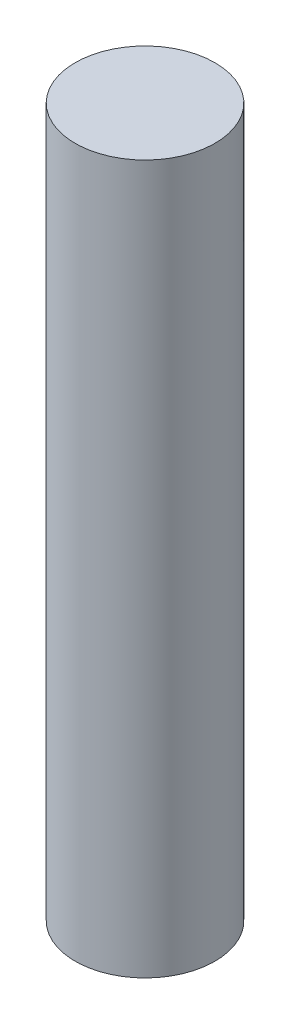
ISO-10303-21;
HEADER;
FILE_DESCRIPTION(('STEP AP214'),'2;1');
FILE_NAME('part.step','',(''),(''),'','','');
FILE_SCHEMA(('AUTOMOTIVE_DESIGN { 1 0 10303 214 1 1 1 1 }'));
ENDSEC;
DATA;
#1=APPLICATION_CONTEXT('core data for automotive mechanical design processes');
#2=APPLICATION_PROTOCOL_DEFINITION('international standard','automotive_design',2000,#1);
#3=PRODUCT_CONTEXT('',#1,'mechanical');
#4=PRODUCT('Part','Part','',(#3));
#5=PRODUCT_RELATED_PRODUCT_CATEGORY('part','',(#4));
#6=PRODUCT_DEFINITION_FORMATION('','',#4);
#7=PRODUCT_DEFINITION_CONTEXT('part definition',#1,'design');
#8=PRODUCT_DEFINITION('design','',#6,#7);
#9=PRODUCT_DEFINITION_SHAPE('','',#8);
#10=(LENGTH_UNIT() NAMED_UNIT(*) SI_UNIT(.MILLI.,.METRE.));
#11=(NAMED_UNIT(*) PLANE_ANGLE_UNIT() SI_UNIT($,.RADIAN.));
#12=(NAMED_UNIT(*) SI_UNIT($,.STERADIAN.) SOLID_ANGLE_UNIT());
#13=UNCERTAINTY_MEASURE_WITH_UNIT(LENGTH_MEASURE(1.E-05),#10,'distance_accuracy_value','');
#14=(GEOMETRIC_REPRESENTATION_CONTEXT(3) GLOBAL_UNCERTAINTY_ASSIGNED_CONTEXT((#13)) GLOBAL_UNIT_ASSIGNED_CONTEXT((#10,
#11,#12)) REPRESENTATION_CONTEXT('',''));
#15=CARTESIAN_POINT('',(0.,0.,0.));
#16=DIRECTION('',(0.,0.,1.));
#17=DIRECTION('',(1.,0.,0.));
#18=AXIS2_PLACEMENT_3D('',#15,#16,#17);
#19=CARTESIAN_POINT('',(0.,19.05,0.));
#20=DIRECTION('',(0.,-1.,0.));
#21=DIRECTION('',(0.,0.,-1.));
#22=AXIS2_PLACEMENT_3D('',#19,#20,#21);
#23=CYLINDRICAL_SURFACE('',#22,1.8796);
#24=CARTESIAN_POINT('',(0.,19.05,0.));
#25=DIRECTION('',(0.,1.,0.));
#26=DIRECTION('',(0.,0.,1.));
#27=AXIS2_PLACEMENT_3D('',#24,#25,#26);
#28=CIRCLE('',#27,1.8796);
#29=CARTESIAN_POINT('',(0.,19.05,-1.8796));
#30=VERTEX_POINT('',#29);
#31=EDGE_CURVE('E10',#30,#30,#28,.T.);
#32=CARTESIAN_POINT('',(0.,0.,0.));
#33=DIRECTION('',(0.,1.,0.));
#34=DIRECTION('',(0.,0.,1.));
#35=AXIS2_PLACEMENT_3D('',#32,#33,#34);
#36=CIRCLE('',#35,1.8796);
#37=CARTESIAN_POINT('',(0.,0.,-1.8796));
#38=VERTEX_POINT('',#37);
#39=EDGE_CURVE('E34',#38,#38,#36,.T.);
#40=CARTESIAN_POINT('',(0.,19.05,-1.8796));
#41=CARTESIAN_POINT('',(0.,18.8515625,-1.8796));
#42=CARTESIAN_POINT('',(0.,18.653125,-1.8796));
#43=CARTESIAN_POINT('',(0.,18.25625,-1.8796));
#44=CARTESIAN_POINT('',(0.,18.0578125,-1.8796));
#45=CARTESIAN_POINT('',(0.,17.6609375,-1.8796));
#46=CARTESIAN_POINT('',(0.,17.4625,-1.8796));
#47=CARTESIAN_POINT('',(0.,17.065625,-1.8796));
#48=CARTESIAN_POINT('',(0.,16.8671875,-1.8796));
#49=CARTESIAN_POINT('',(0.,16.4703125,-1.8796));
#50=CARTESIAN_POINT('',(0.,16.271875,-1.8796));
#51=CARTESIAN_POINT('',(0.,15.875,-1.8796));
#52=CARTESIAN_POINT('',(0.,15.6765625,-1.8796));
#53=CARTESIAN_POINT('',(0.,15.2796875,-1.8796));
#54=CARTESIAN_POINT('',(0.,15.08125,-1.8796));
#55=CARTESIAN_POINT('',(0.,14.684375,-1.8796));
#56=CARTESIAN_POINT('',(0.,14.4859375,-1.8796));
#57=CARTESIAN_POINT('',(0.,14.0890625,-1.8796));
#58=CARTESIAN_POINT('',(0.,13.890625,-1.8796));
#59=CARTESIAN_POINT('',(0.,13.49375,-1.8796));
#60=CARTESIAN_POINT('',(0.,13.2953125,-1.8796));
#61=CARTESIAN_POINT('',(0.,12.8984375,-1.8796));
#62=CARTESIAN_POINT('',(0.,12.7,-1.8796));
#63=CARTESIAN_POINT('',(0.,12.303125,-1.8796));
#64=CARTESIAN_POINT('',(0.,12.1046875,-1.8796));
#65=CARTESIAN_POINT('',(0.,11.7078125,-1.8796));
#66=CARTESIAN_POINT('',(0.,11.509375,-1.8796));
#67=CARTESIAN_POINT('',(0.,11.1125,-1.8796));
#68=CARTESIAN_POINT('',(0.,10.9140625,-1.8796));
#69=CARTESIAN_POINT('',(0.,10.5171875,-1.8796));
#70=CARTESIAN_POINT('',(0.,10.31875,-1.8796));
#71=CARTESIAN_POINT('',(0.,9.921875,-1.8796));
#72=CARTESIAN_POINT('',(0.,9.7234375,-1.8796));
#73=CARTESIAN_POINT('',(0.,9.3265625,-1.8796));
#74=CARTESIAN_POINT('',(0.,9.128125,-1.8796));
#75=CARTESIAN_POINT('',(0.,8.73125,-1.8796));
#76=CARTESIAN_POINT('',(0.,8.5328125,-1.8796));
#77=CARTESIAN_POINT('',(0.,8.1359375,-1.8796));
#78=CARTESIAN_POINT('',(0.,7.9375,-1.8796));
#79=CARTESIAN_POINT('',(0.,7.540625,-1.8796));
#80=CARTESIAN_POINT('',(0.,7.3421875,-1.8796));
#81=CARTESIAN_POINT('',(0.,6.9453125,-1.8796));
#82=CARTESIAN_POINT('',(0.,6.746875,-1.8796));
#83=CARTESIAN_POINT('',(0.,6.35,-1.8796));
#84=CARTESIAN_POINT('',(0.,6.1515625,-1.8796));
#85=CARTESIAN_POINT('',(0.,5.7546875,-1.8796));
#86=CARTESIAN_POINT('',(0.,5.55625,-1.8796));
#87=CARTESIAN_POINT('',(0.,5.159375,-1.8796));
#88=CARTESIAN_POINT('',(0.,4.9609375,-1.8796));
#89=CARTESIAN_POINT('',(0.,4.5640625,-1.8796));
#90=CARTESIAN_POINT('',(0.,4.365625,-1.8796));
#91=CARTESIAN_POINT('',(0.,3.96875,-1.8796));
#92=CARTESIAN_POINT('',(0.,3.7703125,-1.8796));
#93=CARTESIAN_POINT('',(0.,3.3734375,-1.8796));
#94=CARTESIAN_POINT('',(0.,3.175,-1.8796));
#95=CARTESIAN_POINT('',(0.,2.778125,-1.8796));
#96=CARTESIAN_POINT('',(0.,2.5796875,-1.8796));
#97=CARTESIAN_POINT('',(0.,2.1828125,-1.8796));
#98=CARTESIAN_POINT('',(0.,1.984375,-1.8796));
#99=CARTESIAN_POINT('',(0.,1.5875,-1.8796));
#100=CARTESIAN_POINT('',(0.,1.3890625,-1.8796));
#101=CARTESIAN_POINT('',(0.,0.992187500000001,-1.8796));
#102=CARTESIAN_POINT('',(0.,0.793750000000001,-1.8796));
#103=CARTESIAN_POINT('',(0.,0.396875,-1.8796));
#104=CARTESIAN_POINT('',(0.,0.1984375,-1.8796));
#105=CARTESIAN_POINT('',(0.,0.,-1.8796));
#106=B_SPLINE_CURVE_WITH_KNOTS('',3,(#40,#41,#42,#43,#44,#45,#46,#47,#48,#49,#50,#51,#52,#53,
#54,#55,#56,#57,#58,#59,#60,#61,#62,#63,#64,#65,#66,#67,#68,#69,#70,#71,#72,#73,#74,#75,#76,#77,
#78,#79,#80,#81,#82,#83,#84,#85,#86,#87,#88,#89,#90,#91,#92,#93,#94,#95,#96,#97,#98,#99,#100,
#101,#102,#103,#104,#105),.UNSPECIFIED.,.F.,.F.,(4,2,2,2,2,2,2,2,2,2,2,2,2,2,2,2,2,2,2,2,2,2,2,
2,2,2,2,2,2,2,2,2,4),(0.,0.595312499999997,1.190625,1.7859375,2.38125,2.9765625,3.571875,
4.1671875,4.7625,5.3578125,5.953125,6.5484375,7.14375,7.7390625,8.334375,8.9296875,9.525,
10.1203125,10.715625,11.3109375,11.90625,12.5015625,13.096875,13.6921875,14.2875,14.8828125,
15.478125,16.0734375,16.66875,17.2640625,17.859375,18.4546875,19.05),.UNSPECIFIED.);
#107=EDGE_CURVE('BSEAM31',#30,#38,#106,.T.);
#108=ORIENTED_EDGE('',*,*,#31,.F.);
#109=ORIENTED_EDGE('',*,*,#39,.T.);
#110=ORIENTED_EDGE('',*,*,#107,.T.);
#111=ORIENTED_EDGE('',*,*,#107,.F.);
#112=EDGE_LOOP('',(#108,#110,#109,#111));
#113=FACE_BOUND('',#112,.T.);
#114=ADVANCED_FACE('F31',(#113),#23,.T.);
#115=CARTESIAN_POINT('',(0.,19.05,0.));
#116=DIRECTION('',(0.,1.,0.));
#117=DIRECTION('',(0.,0.,1.));
#118=AXIS2_PLACEMENT_3D('',#115,#116,#117);
#119=PLANE('',#118);
#120=ORIENTED_EDGE('',*,*,#31,.T.);
#121=EDGE_LOOP('',(#120));
#122=FACE_BOUND('',#121,.T.);
#123=ADVANCED_FACE('F46',(#122),#119,.T.);
#124=CARTESIAN_POINT('',(0.,0.,0.));
#125=DIRECTION('',(0.,1.,0.));
#126=DIRECTION('',(0.,0.,1.));
#127=AXIS2_PLACEMENT_3D('',#124,#125,#126);
#128=PLANE('',#127);
#129=ORIENTED_EDGE('',*,*,#39,.F.);
#130=EDGE_LOOP('',(#129));
#131=FACE_BOUND('',#130,.T.);
#132=ADVANCED_FACE('F44',(#131),#128,.F.);
#133=CLOSED_SHELL('',(#114,#123,#132));
#134=MANIFOLD_SOLID_BREP('B2',#133);
#135=ADVANCED_BREP_SHAPE_REPRESENTATION('',(#18,#134),#14);
#136=SHAPE_DEFINITION_REPRESENTATION(#9,#135);
ENDSEC;
END-ISO-10303-21;
